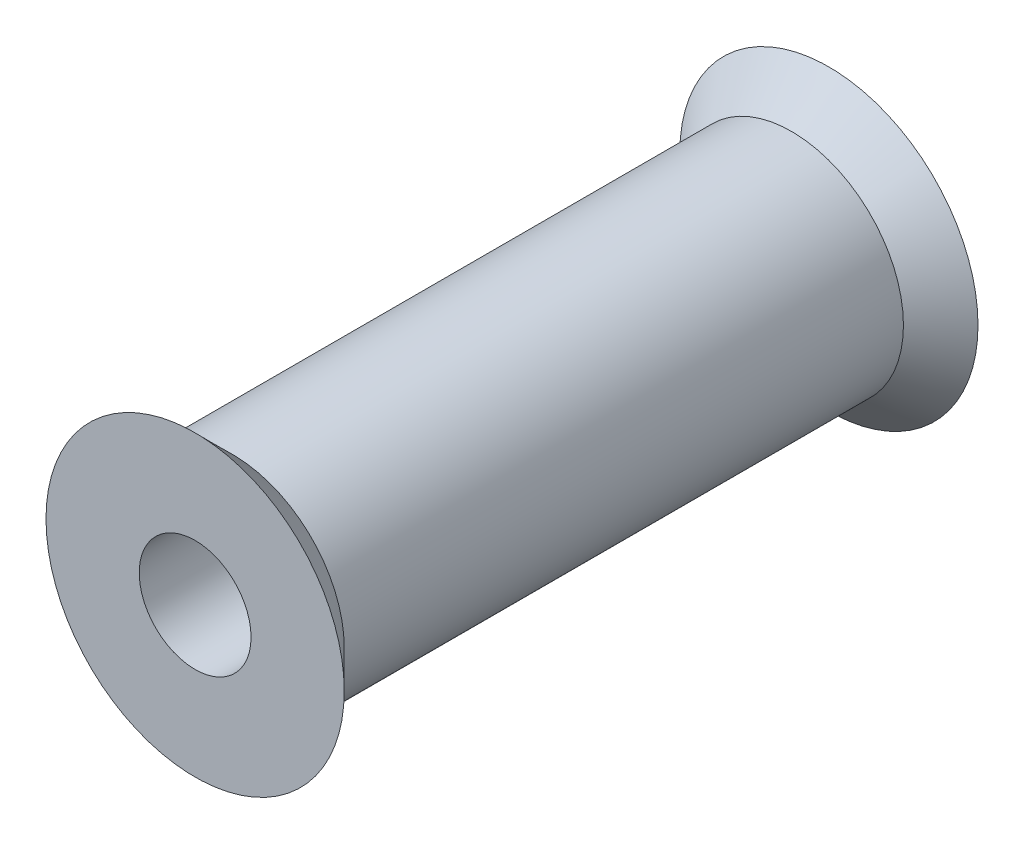
ISO-10303-21;
HEADER;
FILE_DESCRIPTION(('STEP AP214'),'2;1');
FILE_NAME('part.step','',(''),(''),'','','');
FILE_SCHEMA(('AUTOMOTIVE_DESIGN { 1 0 10303 214 1 1 1 1 }'));
ENDSEC;
DATA;
#1=APPLICATION_CONTEXT('core data for automotive mechanical design processes');
#2=APPLICATION_PROTOCOL_DEFINITION('international standard','automotive_design',2000,#1);
#3=PRODUCT_CONTEXT('',#1,'mechanical');
#4=PRODUCT('Part','Part','',(#3));
#5=PRODUCT_RELATED_PRODUCT_CATEGORY('part','',(#4));
#6=PRODUCT_DEFINITION_FORMATION('','',#4);
#7=PRODUCT_DEFINITION_CONTEXT('part definition',#1,'design');
#8=PRODUCT_DEFINITION('design','',#6,#7);
#9=PRODUCT_DEFINITION_SHAPE('','',#8);
#10=(LENGTH_UNIT() NAMED_UNIT(*) SI_UNIT(.MILLI.,.METRE.));
#11=(NAMED_UNIT(*) PLANE_ANGLE_UNIT() SI_UNIT($,.RADIAN.));
#12=(NAMED_UNIT(*) SI_UNIT($,.STERADIAN.) SOLID_ANGLE_UNIT());
#13=UNCERTAINTY_MEASURE_WITH_UNIT(LENGTH_MEASURE(1.E-05),#10,'distance_accuracy_value','');
#14=(GEOMETRIC_REPRESENTATION_CONTEXT(3) GLOBAL_UNCERTAINTY_ASSIGNED_CONTEXT((#13)) GLOBAL_UNIT_ASSIGNED_CONTEXT((#10,
#11,#12)) REPRESENTATION_CONTEXT('',''));
#15=CARTESIAN_POINT('',(0.,0.,0.));
#16=DIRECTION('',(0.,0.,1.));
#17=DIRECTION('',(1.,0.,0.));
#18=AXIS2_PLACEMENT_3D('',#15,#16,#17);
#19=CARTESIAN_POINT('',(4.,0.,0.));
#20=DIRECTION('',(0.,0.,1.));
#21=DIRECTION('',(1.,0.,0.));
#22=AXIS2_PLACEMENT_3D('',#19,#20,#21);
#23=CYLINDRICAL_SURFACE('',#22,3.);
#24=CARTESIAN_POINT('',(4.,0.,-16.));
#25=DIRECTION('',(0.,0.,1.));
#26=DIRECTION('',(1.,0.,0.));
#27=AXIS2_PLACEMENT_3D('',#24,#25,#26);
#28=CIRCLE('',#27,3.);
#29=CARTESIAN_POINT('',(7.,0.,-16.));
#30=VERTEX_POINT('',#29);
#31=EDGE_CURVE('E10',#30,#30,#28,.T.);
#32=ORIENTED_EDGE('',*,*,#31,.T.);
#33=EDGE_LOOP('',(#32));
#34=FACE_BOUND('',#33,.T.);
#35=CARTESIAN_POINT('',(4.,0.,-0.99999999999999));
#36=DIRECTION('',(0.,0.,1.));
#37=DIRECTION('',(1.,0.,0.));
#38=AXIS2_PLACEMENT_3D('',#35,#36,#37);
#39=CIRCLE('',#38,3.);
#40=CARTESIAN_POINT('',(7.,0.,-0.99999999999999));
#41=VERTEX_POINT('',#40);
#42=EDGE_CURVE('E65',#41,#41,#39,.T.);
#43=ORIENTED_EDGE('',*,*,#42,.F.);
#44=EDGE_LOOP('',(#43));
#45=FACE_BOUND('',#44,.T.);
#46=ADVANCED_FACE('F43',(#34,#45),#23,.T.);
#47=CARTESIAN_POINT('',(4.,0.,-17.));
#48=DIRECTION('',(0.,0.,-1.));
#49=DIRECTION('',(-1.,0.,0.));
#50=AXIS2_PLACEMENT_3D('',#47,#48,#49);
#51=CONICAL_SURFACE('',#50,4.,0.785398163397446);
#52=ORIENTED_EDGE('',*,*,#31,.F.);
#53=EDGE_LOOP('',(#52));
#54=FACE_BOUND('',#53,.T.);
#55=CARTESIAN_POINT('',(4.,0.,-17.));
#56=DIRECTION('',(0.,0.,1.));
#57=DIRECTION('',(1.,0.,0.));
#58=AXIS2_PLACEMENT_3D('',#55,#56,#57);
#59=CIRCLE('',#58,4.);
#60=CARTESIAN_POINT('',(8.,0.,-17.));
#61=VERTEX_POINT('',#60);
#62=EDGE_CURVE('E49',#61,#61,#59,.T.);
#63=ORIENTED_EDGE('',*,*,#62,.T.);
#64=EDGE_LOOP('',(#63));
#65=FACE_BOUND('',#64,.T.);
#66=ADVANCED_FACE('F73',(#54,#65),#51,.T.);
#67=CARTESIAN_POINT('',(0.,0.,-17.));
#68=DIRECTION('',(0.,0.,-1.));
#69=DIRECTION('',(-1.,0.,0.));
#70=AXIS2_PLACEMENT_3D('',#67,#68,#69);
#71=PLANE('',#70);
#72=CARTESIAN_POINT('',(4.,0.,-17.));
#73=DIRECTION('',(0.,0.,1.));
#74=DIRECTION('',(1.,0.,0.));
#75=AXIS2_PLACEMENT_3D('',#72,#73,#74);
#76=CIRCLE('',#75,1.5);
#77=CARTESIAN_POINT('',(5.5,0.,-17.));
#78=VERTEX_POINT('',#77);
#79=EDGE_CURVE('E53',#78,#78,#76,.T.);
#80=ORIENTED_EDGE('',*,*,#79,.T.);
#81=EDGE_LOOP('',(#80));
#82=FACE_BOUND('',#81,.T.);
#83=ORIENTED_EDGE('',*,*,#62,.F.);
#84=EDGE_LOOP('',(#83));
#85=FACE_BOUND('',#84,.T.);
#86=ADVANCED_FACE('F77',(#82,#85),#71,.T.);
#87=CARTESIAN_POINT('',(4.,0.,0.));
#88=DIRECTION('',(0.,0.,1.));
#89=DIRECTION('',(1.,0.,0.));
#90=AXIS2_PLACEMENT_3D('',#87,#88,#89);
#91=CYLINDRICAL_SURFACE('',#90,1.5);
#92=ORIENTED_EDGE('',*,*,#79,.F.);
#93=EDGE_LOOP('',(#92));
#94=FACE_BOUND('',#93,.T.);
#95=CARTESIAN_POINT('',(4.,0.,0.));
#96=DIRECTION('',(0.,0.,1.));
#97=DIRECTION('',(1.,0.,0.));
#98=AXIS2_PLACEMENT_3D('',#95,#96,#97);
#99=CIRCLE('',#98,1.5);
#100=CARTESIAN_POINT('',(5.5,0.,0.));
#101=VERTEX_POINT('',#100);
#102=EDGE_CURVE('E57',#101,#101,#99,.T.);
#103=ORIENTED_EDGE('',*,*,#102,.T.);
#104=EDGE_LOOP('',(#103));
#105=FACE_BOUND('',#104,.T.);
#106=ADVANCED_FACE('F82',(#94,#105),#91,.F.);
#107=CARTESIAN_POINT('',(0.,0.,0.));
#108=DIRECTION('',(0.,0.,1.));
#109=DIRECTION('',(1.,0.,0.));
#110=AXIS2_PLACEMENT_3D('',#107,#108,#109);
#111=PLANE('',#110);
#112=CARTESIAN_POINT('',(4.,0.,0.));
#113=DIRECTION('',(0.,0.,1.));
#114=DIRECTION('',(1.,0.,0.));
#115=AXIS2_PLACEMENT_3D('',#112,#113,#114);
#116=CIRCLE('',#115,4.);
#117=CARTESIAN_POINT('',(8.,0.,0.));
#118=VERTEX_POINT('',#117);
#119=EDGE_CURVE('E62',#118,#118,#116,.T.);
#120=ORIENTED_EDGE('',*,*,#119,.T.);
#121=EDGE_LOOP('',(#120));
#122=FACE_BOUND('',#121,.T.);
#123=ORIENTED_EDGE('',*,*,#102,.F.);
#124=EDGE_LOOP('',(#123));
#125=FACE_BOUND('',#124,.T.);
#126=ADVANCED_FACE('F88',(#122,#125),#111,.T.);
#127=CARTESIAN_POINT('',(4.,0.,0.));
#128=DIRECTION('',(0.,0.,1.));
#129=DIRECTION('',(1.,0.,0.));
#130=AXIS2_PLACEMENT_3D('',#127,#128,#129);
#131=CONICAL_SURFACE('',#130,4.,0.785398163397453);
#132=ORIENTED_EDGE('',*,*,#42,.T.);
#133=EDGE_LOOP('',(#132));
#134=FACE_BOUND('',#133,.T.);
#135=ORIENTED_EDGE('',*,*,#119,.F.);
#136=EDGE_LOOP('',(#135));
#137=FACE_BOUND('',#136,.T.);
#138=ADVANCED_FACE('F69',(#134,#137),#131,.T.);
#139=CLOSED_SHELL('',(#46,#66,#86,#106,#126,#138));
#140=MANIFOLD_SOLID_BREP('B2',#139);
#141=ADVANCED_BREP_SHAPE_REPRESENTATION('',(#18,#140),#14);
#142=SHAPE_DEFINITION_REPRESENTATION(#9,#141);
ENDSEC;
END-ISO-10303-21;
